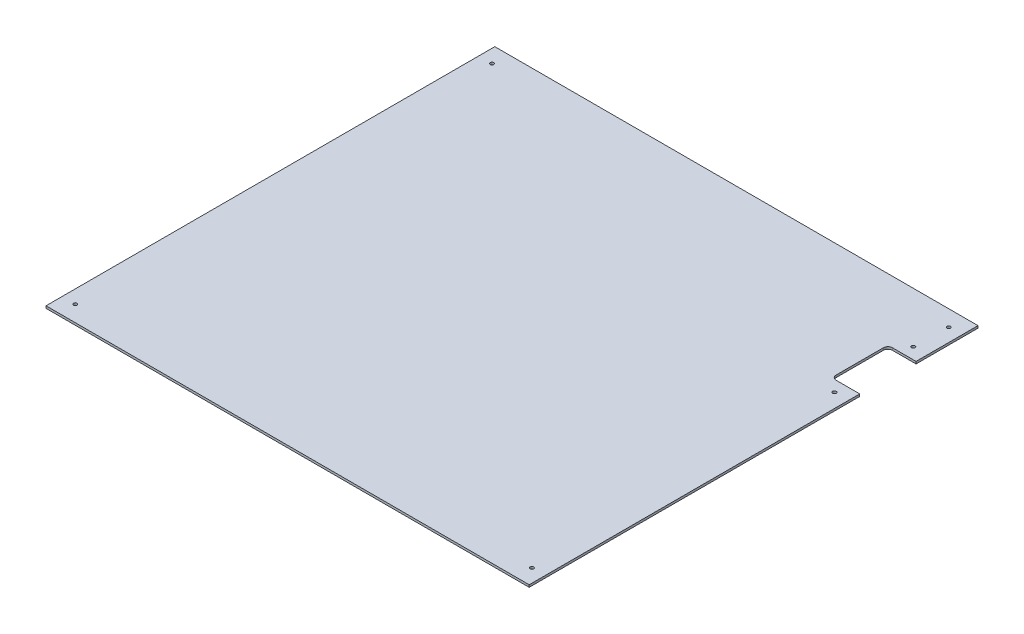
ISO-10303-21;
HEADER;
FILE_DESCRIPTION(('STEP AP214'),'2;1');
FILE_NAME('part.step','',(''),(''),'','','');
FILE_SCHEMA(('AUTOMOTIVE_DESIGN { 1 0 10303 214 1 1 1 1 }'));
ENDSEC;
DATA;
#1=APPLICATION_CONTEXT('core data for automotive mechanical design processes');
#2=APPLICATION_PROTOCOL_DEFINITION('international standard','automotive_design',2000,#1);
#3=PRODUCT_CONTEXT('',#1,'mechanical');
#4=PRODUCT('Part','Part','',(#3));
#5=PRODUCT_RELATED_PRODUCT_CATEGORY('part','',(#4));
#6=PRODUCT_DEFINITION_FORMATION('','',#4);
#7=PRODUCT_DEFINITION_CONTEXT('part definition',#1,'design');
#8=PRODUCT_DEFINITION('design','',#6,#7);
#9=PRODUCT_DEFINITION_SHAPE('','',#8);
#10=(LENGTH_UNIT() NAMED_UNIT(*) SI_UNIT(.MILLI.,.METRE.));
#11=(NAMED_UNIT(*) PLANE_ANGLE_UNIT() SI_UNIT($,.RADIAN.));
#12=(NAMED_UNIT(*) SI_UNIT($,.STERADIAN.) SOLID_ANGLE_UNIT());
#13=UNCERTAINTY_MEASURE_WITH_UNIT(LENGTH_MEASURE(1.E-05),#10,'distance_accuracy_value','');
#14=(GEOMETRIC_REPRESENTATION_CONTEXT(3) GLOBAL_UNCERTAINTY_ASSIGNED_CONTEXT((#13)) GLOBAL_UNIT_ASSIGNED_CONTEXT((#10,
#11,#12)) REPRESENTATION_CONTEXT('',''));
#15=CARTESIAN_POINT('',(0.,0.,0.));
#16=DIRECTION('',(0.,0.,1.));
#17=DIRECTION('',(1.,0.,0.));
#18=AXIS2_PLACEMENT_3D('',#15,#16,#17);
#19=CARTESIAN_POINT('',(429.75,-587.648066447938,-0.750000000000026));
#20=DIRECTION('',(1.,0.,0.));
#21=DIRECTION('',(0.,0.,-1.));
#22=AXIS2_PLACEMENT_3D('',#19,#20,#21);
#23=PLANE('',#22);
#24=DIRECTION('',(0.,1.,0.));
#25=VECTOR('',#24,1.);
#26=CARTESIAN_POINT('',(429.75,-55.9016994374948,-344.25));
#27=LINE('',#26,#25);
#28=CARTESIAN_POINT('',(429.75,0.,-344.25));
#29=VERTEX_POINT('',#28);
#30=CARTESIAN_POINT('',(429.75,2.,-344.25));
#31=VERTEX_POINT('',#30);
#32=EDGE_CURVE('E111',#29,#31,#27,.T.);
#33=ORIENTED_EDGE('',*,*,#32,.F.);
#34=DIRECTION('',(0.,0.,-1.));
#35=VECTOR('',#34,1.);
#36=CARTESIAN_POINT('',(429.75,0.,-0.750000000000026));
#37=LINE('',#36,#35);
#38=CARTESIAN_POINT('',(429.75,0.,-399.25));
#39=VERTEX_POINT('',#38);
#40=EDGE_CURVE('E146',#29,#39,#37,.T.);
#41=ORIENTED_EDGE('',*,*,#40,.T.);
#42=DIRECTION('',(0.,1.,0.));
#43=VECTOR('',#42,1.);
#44=CARTESIAN_POINT('',(429.75,-587.648066447938,-399.25));
#45=LINE('',#44,#43);
#46=CARTESIAN_POINT('',(429.75,2.,-399.25));
#47=VERTEX_POINT('',#46);
#48=EDGE_CURVE('E129',#39,#47,#45,.T.);
#49=ORIENTED_EDGE('',*,*,#48,.T.);
#50=DIRECTION('',(0.,0.,-1.));
#51=VECTOR('',#50,1.);
#52=CARTESIAN_POINT('',(429.75,2.,-0.750000000000026));
#53=LINE('',#52,#51);
#54=EDGE_CURVE('E123',#31,#47,#53,.T.);
#55=ORIENTED_EDGE('',*,*,#54,.F.);
#56=EDGE_LOOP('',(#33,#41,#49,#55));
#57=FACE_BOUND('',#56,.T.);
#58=ADVANCED_FACE('F37',(#57),#23,.T.);
#59=CARTESIAN_POINT('',(0.,2.,0.));
#60=DIRECTION('',(0.,-1.,0.));
#61=DIRECTION('',(0.,0.,-1.));
#62=AXIS2_PLACEMENT_3D('',#59,#60,#61);
#63=PLANE('',#62);
#64=CARTESIAN_POINT('',(417.25,2.,-354.25));
#65=DIRECTION('',(0.,1.,0.));
#66=DIRECTION('',(0.,0.,1.));
#67=AXIS2_PLACEMENT_3D('',#64,#65,#66);
#68=CIRCLE('',#67,1.59999999999996);
#69=CARTESIAN_POINT('',(417.25,2.,-352.65));
#70=VERTEX_POINT('',#69);
#71=EDGE_CURVE('E360',#70,#70,#68,.T.);
#72=ORIENTED_EDGE('',*,*,#71,.F.);
#73=EDGE_LOOP('',(#72));
#74=FACE_BOUND('',#73,.T.);
#75=CARTESIAN_POINT('',(417.25,2.,-284.25));
#76=DIRECTION('',(0.,1.,0.));
#77=DIRECTION('',(0.,0.,1.));
#78=AXIS2_PLACEMENT_3D('',#75,#76,#77);
#79=CIRCLE('',#78,1.59999999999996);
#80=CARTESIAN_POINT('',(417.25,2.,-282.65));
#81=VERTEX_POINT('',#80);
#82=EDGE_CURVE('E367',#81,#81,#79,.T.);
#83=ORIENTED_EDGE('',*,*,#82,.F.);
#84=EDGE_LOOP('',(#83));
#85=FACE_BOUND('',#84,.T.);
#86=CARTESIAN_POINT('',(12.5,2.,-385.));
#87=DIRECTION('',(0.,1.,0.));
#88=DIRECTION('',(0.,0.,1.));
#89=AXIS2_PLACEMENT_3D('',#86,#87,#88);
#90=CIRCLE('',#89,1.55000000000003);
#91=CARTESIAN_POINT('',(12.5,2.,-383.45));
#92=VERTEX_POINT('',#91);
#93=EDGE_CURVE('E172',#92,#92,#90,.T.);
#94=ORIENTED_EDGE('',*,*,#93,.F.);
#95=EDGE_LOOP('',(#94));
#96=FACE_BOUND('',#95,.T.);
#97=CARTESIAN_POINT('',(418.,2.,-385.));
#98=DIRECTION('',(0.,1.,0.));
#99=DIRECTION('',(0.,0.,-1.));
#100=AXIS2_PLACEMENT_3D('',#97,#98,#99);
#101=CIRCLE('',#100,1.55);
#102=CARTESIAN_POINT('',(418.,2.,-386.55));
#103=VERTEX_POINT('',#102);
#104=EDGE_CURVE('E165',#103,#103,#101,.T.);
#105=ORIENTED_EDGE('',*,*,#104,.F.);
#106=EDGE_LOOP('',(#105));
#107=FACE_BOUND('',#106,.T.);
#108=CARTESIAN_POINT('',(418.,2.,-15.));
#109=DIRECTION('',(0.,1.,0.));
#110=DIRECTION('',(0.,0.,1.));
#111=AXIS2_PLACEMENT_3D('',#108,#109,#110);
#112=CIRCLE('',#111,1.54999999999999);
#113=CARTESIAN_POINT('',(418.,2.,-13.45));
#114=VERTEX_POINT('',#113);
#115=EDGE_CURVE('E173',#114,#114,#112,.T.);
#116=ORIENTED_EDGE('',*,*,#115,.F.);
#117=EDGE_LOOP('',(#116));
#118=FACE_BOUND('',#117,.T.);
#119=CARTESIAN_POINT('',(12.5,2.,-15.));
#120=DIRECTION('',(0.,1.,0.));
#121=DIRECTION('',(0.,0.,-1.));
#122=AXIS2_PLACEMENT_3D('',#119,#120,#121);
#123=CIRCLE('',#122,1.55000000000002);
#124=CARTESIAN_POINT('',(12.5,2.,-16.55));
#125=VERTEX_POINT('',#124);
#126=EDGE_CURVE('E154',#125,#125,#123,.T.);
#127=ORIENTED_EDGE('',*,*,#126,.F.);
#128=EDGE_LOOP('',(#127));
#129=FACE_BOUND('',#128,.T.);
#130=DIRECTION('',(0.,0.,1.));
#131=VECTOR('',#130,1.);
#132=CARTESIAN_POINT('',(404.75,2.,-344.25));
#133=LINE('',#132,#131);
#134=CARTESIAN_POINT('',(404.75,2.,-340.25));
#135=VERTEX_POINT('',#134);
#136=CARTESIAN_POINT('',(404.75,2.,-298.25));
#137=VERTEX_POINT('',#136);
#138=EDGE_CURVE('E125',#135,#137,#133,.T.);
#139=ORIENTED_EDGE('',*,*,#138,.F.);
#140=CARTESIAN_POINT('',(408.75,2.,-340.25));
#141=DIRECTION('',(0.,-1.,0.));
#142=DIRECTION('',(0.,0.,-1.));
#143=AXIS2_PLACEMENT_3D('',#140,#141,#142);
#144=CIRCLE('',#143,4.);
#145=CARTESIAN_POINT('',(408.75,2.,-344.25));
#146=VERTEX_POINT('',#145);
#147=EDGE_CURVE('E45',#135,#146,#144,.T.);
#148=ORIENTED_EDGE('',*,*,#147,.T.);
#149=DIRECTION('',(-1.,0.,0.));
#150=VECTOR('',#149,1.);
#151=CARTESIAN_POINT('',(429.75,2.,-344.25));
#152=LINE('',#151,#150);
#153=EDGE_CURVE('E113',#31,#146,#152,.T.);
#154=ORIENTED_EDGE('',*,*,#153,.F.);
#155=ORIENTED_EDGE('',*,*,#54,.T.);
#156=DIRECTION('',(-1.,0.,0.));
#157=VECTOR('',#156,1.);
#158=CARTESIAN_POINT('',(429.75,2.,-399.25));
#159=LINE('',#158,#157);
#160=CARTESIAN_POINT('',(0.75,2.,-399.25));
#161=VERTEX_POINT('',#160);
#162=EDGE_CURVE('E139',#47,#161,#159,.T.);
#163=ORIENTED_EDGE('',*,*,#162,.T.);
#164=DIRECTION('',(0.,0.,1.));
#165=VECTOR('',#164,1.);
#166=CARTESIAN_POINT('',(0.75,2.,-399.25));
#167=LINE('',#166,#165);
#168=CARTESIAN_POINT('',(0.750000000000049,2.,-0.75));
#169=VERTEX_POINT('',#168);
#170=EDGE_CURVE('E163',#161,#169,#167,.T.);
#171=ORIENTED_EDGE('',*,*,#170,.T.);
#172=DIRECTION('',(1.,0.,0.));
#173=VECTOR('',#172,1.);
#174=CARTESIAN_POINT('',(0.750000000000049,2.,-0.75));
#175=LINE('',#174,#173);
#176=CARTESIAN_POINT('',(429.75,2.,-0.750000000000026));
#177=VERTEX_POINT('',#176);
#178=EDGE_CURVE('E159',#169,#177,#175,.T.);
#179=ORIENTED_EDGE('',*,*,#178,.T.);
#180=CARTESIAN_POINT('',(429.75,2.,-294.25));
#181=VERTEX_POINT('',#180);
#182=EDGE_CURVE('E131',#177,#181,#53,.T.);
#183=ORIENTED_EDGE('',*,*,#182,.T.);
#184=DIRECTION('',(1.,0.,0.));
#185=VECTOR('',#184,1.);
#186=CARTESIAN_POINT('',(429.75,2.,-294.25));
#187=LINE('',#186,#185);
#188=CARTESIAN_POINT('',(408.75,2.,-294.25));
#189=VERTEX_POINT('',#188);
#190=EDGE_CURVE('E221',#189,#181,#187,.T.);
#191=ORIENTED_EDGE('',*,*,#190,.F.);
#192=CARTESIAN_POINT('',(408.75,2.,-298.25));
#193=DIRECTION('',(0.,-1.,0.));
#194=DIRECTION('',(0.,0.,-1.));
#195=AXIS2_PLACEMENT_3D('',#192,#193,#194);
#196=CIRCLE('',#195,4.);
#197=EDGE_CURVE('E197',#189,#137,#196,.T.);
#198=ORIENTED_EDGE('',*,*,#197,.T.);
#199=EDGE_LOOP('',(#139,#148,#154,#155,#163,#171,#179,#183,#191,#198));
#200=FACE_BOUND('',#199,.T.);
#201=ADVANCED_FACE('F121',(#74,#85,#96,#107,#118,#129,#200),#63,.F.);
#202=CARTESIAN_POINT('',(0.,0.,0.));
#203=DIRECTION('',(0.,-1.,0.));
#204=DIRECTION('',(0.,0.,-1.));
#205=AXIS2_PLACEMENT_3D('',#202,#203,#204);
#206=PLANE('',#205);
#207=CARTESIAN_POINT('',(417.25,0.,-354.25));
#208=DIRECTION('',(0.,-1.,0.));
#209=DIRECTION('',(0.,0.,-1.));
#210=AXIS2_PLACEMENT_3D('',#207,#208,#209);
#211=CIRCLE('',#210,1.59999999999996);
#212=CARTESIAN_POINT('',(417.25,0.,-352.65));
#213=VERTEX_POINT('',#212);
#214=EDGE_CURVE('E126',#213,#213,#211,.F.);
#215=ORIENTED_EDGE('',*,*,#214,.T.);
#216=EDGE_LOOP('',(#215));
#217=FACE_BOUND('',#216,.T.);
#218=CARTESIAN_POINT('',(417.25,0.,-284.25));
#219=DIRECTION('',(0.,-1.,0.));
#220=DIRECTION('',(0.,0.,-1.));
#221=AXIS2_PLACEMENT_3D('',#218,#219,#220);
#222=CIRCLE('',#221,1.59999999999996);
#223=CARTESIAN_POINT('',(417.25,0.,-282.65));
#224=VERTEX_POINT('',#223);
#225=EDGE_CURVE('E364',#224,#224,#222,.F.);
#226=ORIENTED_EDGE('',*,*,#225,.T.);
#227=EDGE_LOOP('',(#226));
#228=FACE_BOUND('',#227,.T.);
#229=DIRECTION('',(-1.,0.,0.));
#230=VECTOR('',#229,1.);
#231=CARTESIAN_POINT('',(429.75,0.,-344.25));
#232=LINE('',#231,#230);
#233=CARTESIAN_POINT('',(408.75,0.,-344.25));
#234=VERTEX_POINT('',#233);
#235=EDGE_CURVE('E114',#29,#234,#232,.T.);
#236=ORIENTED_EDGE('',*,*,#235,.T.);
#237=CARTESIAN_POINT('',(408.75,0.,-340.25));
#238=DIRECTION('',(0.,-1.,0.));
#239=DIRECTION('',(0.,0.,-1.));
#240=AXIS2_PLACEMENT_3D('',#237,#238,#239);
#241=CIRCLE('',#240,4.);
#242=CARTESIAN_POINT('',(404.75,0.,-340.25));
#243=VERTEX_POINT('',#242);
#244=EDGE_CURVE('E11',#234,#243,#241,.F.);
#245=ORIENTED_EDGE('',*,*,#244,.T.);
#246=DIRECTION('',(0.,0.,1.));
#247=VECTOR('',#246,1.);
#248=CARTESIAN_POINT('',(404.75,0.,-344.25));
#249=LINE('',#248,#247);
#250=CARTESIAN_POINT('',(404.75,0.,-298.25));
#251=VERTEX_POINT('',#250);
#252=EDGE_CURVE('E210',#243,#251,#249,.T.);
#253=ORIENTED_EDGE('',*,*,#252,.T.);
#254=CARTESIAN_POINT('',(408.75,0.,-298.25));
#255=DIRECTION('',(0.,-1.,0.));
#256=DIRECTION('',(0.,0.,-1.));
#257=AXIS2_PLACEMENT_3D('',#254,#255,#256);
#258=CIRCLE('',#257,4.);
#259=CARTESIAN_POINT('',(408.75,0.,-294.25));
#260=VERTEX_POINT('',#259);
#261=EDGE_CURVE('E199',#251,#260,#258,.F.);
#262=ORIENTED_EDGE('',*,*,#261,.T.);
#263=DIRECTION('',(1.,0.,0.));
#264=VECTOR('',#263,1.);
#265=CARTESIAN_POINT('',(429.75,0.,-294.25));
#266=LINE('',#265,#264);
#267=CARTESIAN_POINT('',(429.75,0.,-294.25));
#268=VERTEX_POINT('',#267);
#269=EDGE_CURVE('E207',#260,#268,#266,.T.);
#270=ORIENTED_EDGE('',*,*,#269,.T.);
#271=CARTESIAN_POINT('',(429.75,0.,-0.750000000000026));
#272=VERTEX_POINT('',#271);
#273=EDGE_CURVE('E141',#272,#268,#37,.T.);
#274=ORIENTED_EDGE('',*,*,#273,.F.);
#275=DIRECTION('',(1.,0.,0.));
#276=VECTOR('',#275,1.);
#277=CARTESIAN_POINT('',(0.750000000000049,0.,-0.75));
#278=LINE('',#277,#276);
#279=CARTESIAN_POINT('',(0.750000000000049,0.,-0.75));
#280=VERTEX_POINT('',#279);
#281=EDGE_CURVE('E147',#280,#272,#278,.T.);
#282=ORIENTED_EDGE('',*,*,#281,.F.);
#283=DIRECTION('',(0.,0.,1.));
#284=VECTOR('',#283,1.);
#285=CARTESIAN_POINT('',(0.75,0.,-399.25));
#286=LINE('',#285,#284);
#287=CARTESIAN_POINT('',(0.749999999999973,0.,-399.25));
#288=VERTEX_POINT('',#287);
#289=EDGE_CURVE('E150',#288,#280,#286,.T.);
#290=ORIENTED_EDGE('',*,*,#289,.F.);
#291=DIRECTION('',(-1.,0.,0.));
#292=VECTOR('',#291,1.);
#293=CARTESIAN_POINT('',(429.75,0.,-399.25));
#294=LINE('',#293,#292);
#295=EDGE_CURVE('E145',#39,#288,#294,.T.);
#296=ORIENTED_EDGE('',*,*,#295,.F.);
#297=ORIENTED_EDGE('',*,*,#40,.F.);
#298=EDGE_LOOP('',(#236,#245,#253,#262,#270,#274,#282,#290,#296,#297));
#299=FACE_BOUND('',#298,.T.);
#300=CARTESIAN_POINT('',(12.5,0.,-385.));
#301=DIRECTION('',(0.,-1.,0.));
#302=DIRECTION('',(0.,0.,-1.));
#303=AXIS2_PLACEMENT_3D('',#300,#301,#302);
#304=CIRCLE('',#303,1.55000000000003);
#305=CARTESIAN_POINT('',(12.5,0.,-386.55));
#306=VERTEX_POINT('',#305);
#307=EDGE_CURVE('E185',#306,#306,#304,.F.);
#308=ORIENTED_EDGE('',*,*,#307,.T.);
#309=EDGE_LOOP('',(#308));
#310=FACE_BOUND('',#309,.T.);
#311=CARTESIAN_POINT('',(418.,0.,-385.));
#312=DIRECTION('',(0.,-1.,0.));
#313=DIRECTION('',(0.,0.,-1.));
#314=AXIS2_PLACEMENT_3D('',#311,#312,#313);
#315=CIRCLE('',#314,1.55);
#316=CARTESIAN_POINT('',(418.,0.,-386.55));
#317=VERTEX_POINT('',#316);
#318=EDGE_CURVE('E168',#317,#317,#315,.F.);
#319=ORIENTED_EDGE('',*,*,#318,.T.);
#320=EDGE_LOOP('',(#319));
#321=FACE_BOUND('',#320,.T.);
#322=CARTESIAN_POINT('',(418.,0.,-15.));
#323=DIRECTION('',(0.,-1.,0.));
#324=DIRECTION('',(0.,0.,-1.));
#325=AXIS2_PLACEMENT_3D('',#322,#323,#324);
#326=CIRCLE('',#325,1.54999999999999);
#327=CARTESIAN_POINT('',(418.,0.,-16.55));
#328=VERTEX_POINT('',#327);
#329=EDGE_CURVE('E169',#328,#328,#326,.F.);
#330=ORIENTED_EDGE('',*,*,#329,.T.);
#331=EDGE_LOOP('',(#330));
#332=FACE_BOUND('',#331,.T.);
#333=CARTESIAN_POINT('',(12.5,0.,-15.));
#334=DIRECTION('',(0.,-1.,0.));
#335=DIRECTION('',(0.,0.,-1.));
#336=AXIS2_PLACEMENT_3D('',#333,#334,#335);
#337=CIRCLE('',#336,1.55000000000002);
#338=CARTESIAN_POINT('',(12.5,0.,-16.55));
#339=VERTEX_POINT('',#338);
#340=EDGE_CURVE('E176',#339,#339,#337,.F.);
#341=ORIENTED_EDGE('',*,*,#340,.T.);
#342=EDGE_LOOP('',(#341));
#343=FACE_BOUND('',#342,.T.);
#344=ADVANCED_FACE('F204',(#217,#228,#299,#310,#321,#332,#343),#206,.T.);
#345=CARTESIAN_POINT('',(12.5,-4.38406204335671,-385.));
#346=DIRECTION('',(0.,1.,0.));
#347=DIRECTION('',(0.,0.,1.));
#348=AXIS2_PLACEMENT_3D('',#345,#346,#347);
#349=CYLINDRICAL_SURFACE('',#348,1.55000000000003);
#350=ORIENTED_EDGE('',*,*,#93,.T.);
#351=EDGE_LOOP('',(#350));
#352=FACE_BOUND('',#351,.T.);
#353=ORIENTED_EDGE('',*,*,#307,.F.);
#354=EDGE_LOOP('',(#353));
#355=FACE_BOUND('',#354,.T.);
#356=ADVANCED_FACE('F269',(#352,#355),#349,.F.);
#357=CARTESIAN_POINT('',(418.,-4.38406204335671,-385.));
#358=DIRECTION('',(0.,1.,0.));
#359=DIRECTION('',(0.,0.,1.));
#360=AXIS2_PLACEMENT_3D('',#357,#358,#359);
#361=CYLINDRICAL_SURFACE('',#360,1.55);
#362=ORIENTED_EDGE('',*,*,#104,.T.);
#363=EDGE_LOOP('',(#362));
#364=FACE_BOUND('',#363,.T.);
#365=ORIENTED_EDGE('',*,*,#318,.F.);
#366=EDGE_LOOP('',(#365));
#367=FACE_BOUND('',#366,.T.);
#368=ADVANCED_FACE('F388',(#364,#367),#361,.F.);
#369=CARTESIAN_POINT('',(418.,-4.38406204335671,-15.));
#370=DIRECTION('',(0.,1.,0.));
#371=DIRECTION('',(0.,0.,1.));
#372=AXIS2_PLACEMENT_3D('',#369,#370,#371);
#373=CYLINDRICAL_SURFACE('',#372,1.54999999999999);
#374=ORIENTED_EDGE('',*,*,#115,.T.);
#375=EDGE_LOOP('',(#374));
#376=FACE_BOUND('',#375,.T.);
#377=ORIENTED_EDGE('',*,*,#329,.F.);
#378=EDGE_LOOP('',(#377));
#379=FACE_BOUND('',#378,.T.);
#380=ADVANCED_FACE('F256',(#376,#379),#373,.F.);
#381=CARTESIAN_POINT('',(12.5,-4.38406204335671,-15.));
#382=DIRECTION('',(0.,1.,0.));
#383=DIRECTION('',(0.,0.,1.));
#384=AXIS2_PLACEMENT_3D('',#381,#382,#383);
#385=CYLINDRICAL_SURFACE('',#384,1.55000000000002);
#386=ORIENTED_EDGE('',*,*,#126,.T.);
#387=EDGE_LOOP('',(#386));
#388=FACE_BOUND('',#387,.T.);
#389=ORIENTED_EDGE('',*,*,#340,.F.);
#390=EDGE_LOOP('',(#389));
#391=FACE_BOUND('',#390,.T.);
#392=ADVANCED_FACE('F249',(#388,#391),#385,.F.);
#393=DIRECTION('',(0.,1.,0.));
#394=VECTOR('',#393,1.);
#395=CARTESIAN_POINT('',(429.75,-55.9016994374948,-294.25));
#396=LINE('',#395,#394);
#397=EDGE_CURVE('E119',#268,#181,#396,.T.);
#398=ORIENTED_EDGE('',*,*,#397,.T.);
#399=ORIENTED_EDGE('',*,*,#182,.F.);
#400=DIRECTION('',(0.,1.,0.));
#401=VECTOR('',#400,1.);
#402=CARTESIAN_POINT('',(429.75,-587.648066447938,-0.750000000000026));
#403=LINE('',#402,#401);
#404=EDGE_CURVE('E118',#272,#177,#403,.T.);
#405=ORIENTED_EDGE('',*,*,#404,.F.);
#406=ORIENTED_EDGE('',*,*,#273,.T.);
#407=EDGE_LOOP('',(#398,#399,#405,#406));
#408=FACE_BOUND('',#407,.T.);
#409=ADVANCED_FACE('F247',(#408),#23,.T.);
#410=CARTESIAN_POINT('',(0.750000000000049,-587.648066447938,-0.75));
#411=DIRECTION('',(0.,0.,1.));
#412=DIRECTION('',(1.,0.,0.));
#413=AXIS2_PLACEMENT_3D('',#410,#411,#412);
#414=PLANE('',#413);
#415=ORIENTED_EDGE('',*,*,#281,.T.);
#416=ORIENTED_EDGE('',*,*,#404,.T.);
#417=ORIENTED_EDGE('',*,*,#178,.F.);
#418=DIRECTION('',(0.,1.,0.));
#419=VECTOR('',#418,1.);
#420=CARTESIAN_POINT('',(0.750000000000049,-587.648066447938,-0.75));
#421=LINE('',#420,#419);
#422=EDGE_CURVE('E135',#280,#169,#421,.T.);
#423=ORIENTED_EDGE('',*,*,#422,.F.);
#424=EDGE_LOOP('',(#415,#416,#417,#423));
#425=FACE_BOUND('',#424,.T.);
#426=ADVANCED_FACE('F244',(#425),#414,.T.);
#427=CARTESIAN_POINT('',(0.75,-587.648066447938,-399.25));
#428=DIRECTION('',(-1.,0.,0.));
#429=DIRECTION('',(0.,0.,1.));
#430=AXIS2_PLACEMENT_3D('',#427,#428,#429);
#431=PLANE('',#430);
#432=ORIENTED_EDGE('',*,*,#289,.T.);
#433=ORIENTED_EDGE('',*,*,#422,.T.);
#434=ORIENTED_EDGE('',*,*,#170,.F.);
#435=DIRECTION('',(0.,1.,0.));
#436=VECTOR('',#435,1.);
#437=CARTESIAN_POINT('',(0.75,-587.648066447938,-399.25));
#438=LINE('',#437,#436);
#439=EDGE_CURVE('E160',#288,#161,#438,.T.);
#440=ORIENTED_EDGE('',*,*,#439,.F.);
#441=EDGE_LOOP('',(#432,#433,#434,#440));
#442=FACE_BOUND('',#441,.T.);
#443=ADVANCED_FACE('F237',(#442),#431,.T.);
#444=CARTESIAN_POINT('',(429.75,-587.648066447938,-399.25));
#445=DIRECTION('',(0.,0.,-1.));
#446=DIRECTION('',(-1.,0.,0.));
#447=AXIS2_PLACEMENT_3D('',#444,#445,#446);
#448=PLANE('',#447);
#449=ORIENTED_EDGE('',*,*,#295,.T.);
#450=ORIENTED_EDGE('',*,*,#439,.T.);
#451=ORIENTED_EDGE('',*,*,#162,.F.);
#452=ORIENTED_EDGE('',*,*,#48,.F.);
#453=EDGE_LOOP('',(#449,#450,#451,#452));
#454=FACE_BOUND('',#453,.T.);
#455=ADVANCED_FACE('F239',(#454),#448,.T.);
#456=CARTESIAN_POINT('',(429.75,-55.9016994374948,-344.25));
#457=DIRECTION('',(0.,0.,-1.));
#458=DIRECTION('',(-1.,0.,0.));
#459=AXIS2_PLACEMENT_3D('',#456,#457,#458);
#460=PLANE('',#459);
#461=ORIENTED_EDGE('',*,*,#153,.T.);
#462=DIRECTION('',(0.,1.,0.));
#463=VECTOR('',#462,1.);
#464=CARTESIAN_POINT('',(408.75,0.,-344.25));
#465=LINE('',#464,#463);
#466=EDGE_CURVE('E52',#146,#234,#465,.F.);
#467=ORIENTED_EDGE('',*,*,#466,.T.);
#468=ORIENTED_EDGE('',*,*,#235,.F.);
#469=ORIENTED_EDGE('',*,*,#32,.T.);
#470=EDGE_LOOP('',(#461,#467,#468,#469));
#471=FACE_BOUND('',#470,.T.);
#472=ADVANCED_FACE('F112',(#471),#460,.F.);
#473=CARTESIAN_POINT('',(404.75,-55.9016994374948,-344.25));
#474=DIRECTION('',(-1.,0.,0.));
#475=DIRECTION('',(0.,0.,1.));
#476=AXIS2_PLACEMENT_3D('',#473,#474,#475);
#477=PLANE('',#476);
#478=ORIENTED_EDGE('',*,*,#138,.T.);
#479=DIRECTION('',(0.,1.,0.));
#480=VECTOR('',#479,1.);
#481=CARTESIAN_POINT('',(404.75,0.,-298.25));
#482=LINE('',#481,#480);
#483=EDGE_CURVE('E194',#137,#251,#482,.F.);
#484=ORIENTED_EDGE('',*,*,#483,.T.);
#485=ORIENTED_EDGE('',*,*,#252,.F.);
#486=DIRECTION('',(0.,1.,0.));
#487=VECTOR('',#486,1.);
#488=CARTESIAN_POINT('',(404.75,2.,-340.25));
#489=LINE('',#488,#487);
#490=EDGE_CURVE('E191',#243,#135,#489,.T.);
#491=ORIENTED_EDGE('',*,*,#490,.T.);
#492=EDGE_LOOP('',(#478,#484,#485,#491));
#493=FACE_BOUND('',#492,.T.);
#494=ADVANCED_FACE('F223',(#493),#477,.F.);
#495=CARTESIAN_POINT('',(429.75,-55.9016994374948,-294.25));
#496=DIRECTION('',(0.,0.,1.));
#497=DIRECTION('',(1.,0.,0.));
#498=AXIS2_PLACEMENT_3D('',#495,#496,#497);
#499=PLANE('',#498);
#500=ORIENTED_EDGE('',*,*,#269,.F.);
#501=DIRECTION('',(0.,1.,0.));
#502=VECTOR('',#501,1.);
#503=CARTESIAN_POINT('',(408.75,2.,-294.25));
#504=LINE('',#503,#502);
#505=EDGE_CURVE('E188',#260,#189,#504,.T.);
#506=ORIENTED_EDGE('',*,*,#505,.T.);
#507=ORIENTED_EDGE('',*,*,#190,.T.);
#508=ORIENTED_EDGE('',*,*,#397,.F.);
#509=EDGE_LOOP('',(#500,#506,#507,#508));
#510=FACE_BOUND('',#509,.T.);
#511=ADVANCED_FACE('F215',(#510),#499,.F.);
#512=CARTESIAN_POINT('',(408.75,-55.9016994374948,-298.25));
#513=DIRECTION('',(0.,-1.,0.));
#514=DIRECTION('',(0.,0.,-1.));
#515=AXIS2_PLACEMENT_3D('',#512,#513,#514);
#516=CYLINDRICAL_SURFACE('',#515,4.);
#517=ORIENTED_EDGE('',*,*,#261,.F.);
#518=ORIENTED_EDGE('',*,*,#483,.F.);
#519=ORIENTED_EDGE('',*,*,#197,.F.);
#520=ORIENTED_EDGE('',*,*,#505,.F.);
#521=EDGE_LOOP('',(#517,#518,#519,#520));
#522=FACE_BOUND('',#521,.T.);
#523=ADVANCED_FACE('F219',(#522),#516,.F.);
#524=CARTESIAN_POINT('',(408.75,-55.9016994374948,-340.25));
#525=DIRECTION('',(0.,-1.,0.));
#526=DIRECTION('',(0.,0.,-1.));
#527=AXIS2_PLACEMENT_3D('',#524,#525,#526);
#528=CYLINDRICAL_SURFACE('',#527,4.);
#529=ORIENTED_EDGE('',*,*,#244,.F.);
#530=ORIENTED_EDGE('',*,*,#466,.F.);
#531=ORIENTED_EDGE('',*,*,#147,.F.);
#532=ORIENTED_EDGE('',*,*,#490,.F.);
#533=EDGE_LOOP('',(#529,#530,#531,#532));
#534=FACE_BOUND('',#533,.T.);
#535=ADVANCED_FACE('F39',(#534),#528,.F.);
#536=CARTESIAN_POINT('',(417.25,-4.52548339959372,-284.25));
#537=DIRECTION('',(0.,1.,0.));
#538=DIRECTION('',(0.,0.,1.));
#539=AXIS2_PLACEMENT_3D('',#536,#537,#538);
#540=CYLINDRICAL_SURFACE('',#539,1.59999999999996);
#541=CARTESIAN_POINT('',(417.25,2.,-282.65));
#542=CARTESIAN_POINT('',(417.25,1.97916666666667,-282.65));
#543=CARTESIAN_POINT('',(417.25,1.95833333333333,-282.65));
#544=CARTESIAN_POINT('',(417.25,1.91666666666667,-282.65));
#545=CARTESIAN_POINT('',(417.25,1.89583333333333,-282.65));
#546=CARTESIAN_POINT('',(417.25,1.85416666666667,-282.65));
#547=CARTESIAN_POINT('',(417.25,1.83333333333333,-282.65));
#548=CARTESIAN_POINT('',(417.25,1.79166666666667,-282.65));
#549=CARTESIAN_POINT('',(417.25,1.77083333333333,-282.65));
#550=CARTESIAN_POINT('',(417.25,1.72916666666667,-282.65));
#551=CARTESIAN_POINT('',(417.25,1.70833333333333,-282.65));
#552=CARTESIAN_POINT('',(417.25,1.66666666666667,-282.65));
#553=CARTESIAN_POINT('',(417.25,1.64583333333333,-282.65));
#554=CARTESIAN_POINT('',(417.25,1.60416666666667,-282.65));
#555=CARTESIAN_POINT('',(417.25,1.58333333333333,-282.65));
#556=CARTESIAN_POINT('',(417.25,1.54166666666667,-282.65));
#557=CARTESIAN_POINT('',(417.25,1.52083333333333,-282.65));
#558=CARTESIAN_POINT('',(417.25,1.47916666666667,-282.65));
#559=CARTESIAN_POINT('',(417.25,1.45833333333333,-282.65));
#560=CARTESIAN_POINT('',(417.25,1.41666666666667,-282.65));
#561=CARTESIAN_POINT('',(417.25,1.39583333333333,-282.65));
#562=CARTESIAN_POINT('',(417.25,1.35416666666667,-282.65));
#563=CARTESIAN_POINT('',(417.25,1.33333333333333,-282.65));
#564=CARTESIAN_POINT('',(417.25,1.29166666666667,-282.65));
#565=CARTESIAN_POINT('',(417.25,1.27083333333333,-282.65));
#566=CARTESIAN_POINT('',(417.25,1.22916666666667,-282.65));
#567=CARTESIAN_POINT('',(417.25,1.20833333333333,-282.65));
#568=CARTESIAN_POINT('',(417.25,1.16666666666667,-282.65));
#569=CARTESIAN_POINT('',(417.25,1.14583333333333,-282.65));
#570=CARTESIAN_POINT('',(417.25,1.10416666666667,-282.65));
#571=CARTESIAN_POINT('',(417.25,1.08333333333333,-282.65));
#572=CARTESIAN_POINT('',(417.25,1.04166666666667,-282.65));
#573=CARTESIAN_POINT('',(417.25,1.02083333333333,-282.65));
#574=CARTESIAN_POINT('',(417.25,0.979166666666667,-282.65));
#575=CARTESIAN_POINT('',(417.25,0.958333333333333,-282.65));
#576=CARTESIAN_POINT('',(417.25,0.916666666666667,-282.65));
#577=CARTESIAN_POINT('',(417.25,0.895833333333333,-282.65));
#578=CARTESIAN_POINT('',(417.25,0.854166666666667,-282.65));
#579=CARTESIAN_POINT('',(417.25,0.833333333333333,-282.65));
#580=CARTESIAN_POINT('',(417.25,0.791666666666667,-282.65));
#581=CARTESIAN_POINT('',(417.25,0.770833333333333,-282.65));
#582=CARTESIAN_POINT('',(417.25,0.729166666666667,-282.65));
#583=CARTESIAN_POINT('',(417.25,0.708333333333333,-282.65));
#584=CARTESIAN_POINT('',(417.25,0.666666666666667,-282.65));
#585=CARTESIAN_POINT('',(417.25,0.645833333333334,-282.65));
#586=CARTESIAN_POINT('',(417.25,0.604166666666667,-282.65));
#587=CARTESIAN_POINT('',(417.25,0.583333333333334,-282.65));
#588=CARTESIAN_POINT('',(417.25,0.541666666666667,-282.65));
#589=CARTESIAN_POINT('',(417.25,0.520833333333334,-282.65));
#590=CARTESIAN_POINT('',(417.25,0.479166666666667,-282.65));
#591=CARTESIAN_POINT('',(417.25,0.458333333333334,-282.65));
#592=CARTESIAN_POINT('',(417.25,0.416666666666667,-282.65));
#593=CARTESIAN_POINT('',(417.25,0.395833333333334,-282.65));
#594=CARTESIAN_POINT('',(417.25,0.354166666666667,-282.65));
#595=CARTESIAN_POINT('',(417.25,0.333333333333334,-282.65));
#596=CARTESIAN_POINT('',(417.25,0.291666666666668,-282.65));
#597=CARTESIAN_POINT('',(417.25,0.270833333333334,-282.65));
#598=CARTESIAN_POINT('',(417.25,0.229166666666668,-282.65));
#599=CARTESIAN_POINT('',(417.25,0.208333333333334,-282.65));
#600=CARTESIAN_POINT('',(417.25,0.166666666666668,-282.65));
#601=CARTESIAN_POINT('',(417.25,0.145833333333334,-282.65));
#602=CARTESIAN_POINT('',(417.25,0.104166666666668,-282.65));
#603=CARTESIAN_POINT('',(417.25,0.0833333333333343,-282.65));
#604=CARTESIAN_POINT('',(417.25,0.0416666666666676,-282.65));
#605=CARTESIAN_POINT('',(417.25,0.0208333333333342,-282.65));
#606=CARTESIAN_POINT('',(417.25,0.,-282.65));
#607=B_SPLINE_CURVE_WITH_KNOTS('',3,(#541,#542,#543,#544,#545,#546,#547,#548,#549,#550,#551,
#552,#553,#554,#555,#556,#557,#558,#559,#560,#561,#562,#563,#564,#565,#566,#567,#568,#569,#570,
#571,#572,#573,#574,#575,#576,#577,#578,#579,#580,#581,#582,#583,#584,#585,#586,#587,#588,#589,
#590,#591,#592,#593,#594,#595,#596,#597,#598,#599,#600,#601,#602,#603,#604,#605,#606),
.UNSPECIFIED.,.F.,.F.,(4,2,2,2,2,2,2,2,2,2,2,2,2,2,2,2,2,2,2,2,2,2,2,2,2,2,2,2,2,2,2,2,4),(0.,
0.0625000000000001,0.125,0.1875,0.25,0.312499999999999,0.374999999999999,0.4375,0.5,0.5625,
0.625,0.6875,0.749999999999999,0.812499999999999,0.874999999999999,0.937499999999999,
0.999999999999999,1.0625,1.125,1.1875,1.25,1.3125,1.375,1.4375,1.5,1.5625,1.625,1.6875,1.75,
1.8125,1.875,1.9375,2.),.UNSPECIFIED.);
#608=EDGE_CURVE('BSEAM280',#81,#224,#607,.T.);
#609=ORIENTED_EDGE('',*,*,#82,.T.);
#610=ORIENTED_EDGE('',*,*,#225,.F.);
#611=ORIENTED_EDGE('',*,*,#608,.T.);
#612=ORIENTED_EDGE('',*,*,#608,.F.);
#613=EDGE_LOOP('',(#609,#611,#610,#612));
#614=FACE_BOUND('',#613,.T.);
#615=ADVANCED_FACE('F280',(#614),#540,.F.);
#616=CARTESIAN_POINT('',(417.25,-4.52548339959372,-354.25));
#617=DIRECTION('',(0.,1.,0.));
#618=DIRECTION('',(0.,0.,1.));
#619=AXIS2_PLACEMENT_3D('',#616,#617,#618);
#620=CYLINDRICAL_SURFACE('',#619,1.59999999999996);
#621=CARTESIAN_POINT('',(417.25,2.,-352.65));
#622=CARTESIAN_POINT('',(417.25,1.97916666666667,-352.65));
#623=CARTESIAN_POINT('',(417.25,1.95833333333333,-352.65));
#624=CARTESIAN_POINT('',(417.25,1.91666666666667,-352.65));
#625=CARTESIAN_POINT('',(417.25,1.89583333333333,-352.65));
#626=CARTESIAN_POINT('',(417.25,1.85416666666667,-352.65));
#627=CARTESIAN_POINT('',(417.25,1.83333333333333,-352.65));
#628=CARTESIAN_POINT('',(417.25,1.79166666666667,-352.65));
#629=CARTESIAN_POINT('',(417.25,1.77083333333333,-352.65));
#630=CARTESIAN_POINT('',(417.25,1.72916666666667,-352.65));
#631=CARTESIAN_POINT('',(417.25,1.70833333333333,-352.65));
#632=CARTESIAN_POINT('',(417.25,1.66666666666667,-352.65));
#633=CARTESIAN_POINT('',(417.25,1.64583333333333,-352.65));
#634=CARTESIAN_POINT('',(417.25,1.60416666666667,-352.65));
#635=CARTESIAN_POINT('',(417.25,1.58333333333333,-352.65));
#636=CARTESIAN_POINT('',(417.25,1.54166666666667,-352.65));
#637=CARTESIAN_POINT('',(417.25,1.52083333333333,-352.65));
#638=CARTESIAN_POINT('',(417.25,1.47916666666667,-352.65));
#639=CARTESIAN_POINT('',(417.25,1.45833333333333,-352.65));
#640=CARTESIAN_POINT('',(417.25,1.41666666666667,-352.65));
#641=CARTESIAN_POINT('',(417.25,1.39583333333333,-352.65));
#642=CARTESIAN_POINT('',(417.25,1.35416666666667,-352.65));
#643=CARTESIAN_POINT('',(417.25,1.33333333333333,-352.65));
#644=CARTESIAN_POINT('',(417.25,1.29166666666667,-352.65));
#645=CARTESIAN_POINT('',(417.25,1.27083333333333,-352.65));
#646=CARTESIAN_POINT('',(417.25,1.22916666666667,-352.65));
#647=CARTESIAN_POINT('',(417.25,1.20833333333333,-352.65));
#648=CARTESIAN_POINT('',(417.25,1.16666666666667,-352.65));
#649=CARTESIAN_POINT('',(417.25,1.14583333333333,-352.65));
#650=CARTESIAN_POINT('',(417.25,1.10416666666667,-352.65));
#651=CARTESIAN_POINT('',(417.25,1.08333333333333,-352.65));
#652=CARTESIAN_POINT('',(417.25,1.04166666666667,-352.65));
#653=CARTESIAN_POINT('',(417.25,1.02083333333333,-352.65));
#654=CARTESIAN_POINT('',(417.25,0.979166666666667,-352.65));
#655=CARTESIAN_POINT('',(417.25,0.958333333333333,-352.65));
#656=CARTESIAN_POINT('',(417.25,0.916666666666667,-352.65));
#657=CARTESIAN_POINT('',(417.25,0.895833333333333,-352.65));
#658=CARTESIAN_POINT('',(417.25,0.854166666666667,-352.65));
#659=CARTESIAN_POINT('',(417.25,0.833333333333333,-352.65));
#660=CARTESIAN_POINT('',(417.25,0.791666666666667,-352.65));
#661=CARTESIAN_POINT('',(417.25,0.770833333333333,-352.65));
#662=CARTESIAN_POINT('',(417.25,0.729166666666667,-352.65));
#663=CARTESIAN_POINT('',(417.25,0.708333333333333,-352.65));
#664=CARTESIAN_POINT('',(417.25,0.666666666666667,-352.65));
#665=CARTESIAN_POINT('',(417.25,0.645833333333334,-352.65));
#666=CARTESIAN_POINT('',(417.25,0.604166666666667,-352.65));
#667=CARTESIAN_POINT('',(417.25,0.583333333333334,-352.65));
#668=CARTESIAN_POINT('',(417.25,0.541666666666667,-352.65));
#669=CARTESIAN_POINT('',(417.25,0.520833333333334,-352.65));
#670=CARTESIAN_POINT('',(417.25,0.479166666666667,-352.65));
#671=CARTESIAN_POINT('',(417.25,0.458333333333334,-352.65));
#672=CARTESIAN_POINT('',(417.25,0.416666666666667,-352.65));
#673=CARTESIAN_POINT('',(417.25,0.395833333333334,-352.65));
#674=CARTESIAN_POINT('',(417.25,0.354166666666667,-352.65));
#675=CARTESIAN_POINT('',(417.25,0.333333333333334,-352.65));
#676=CARTESIAN_POINT('',(417.25,0.291666666666668,-352.65));
#677=CARTESIAN_POINT('',(417.25,0.270833333333334,-352.65));
#678=CARTESIAN_POINT('',(417.25,0.229166666666668,-352.65));
#679=CARTESIAN_POINT('',(417.25,0.208333333333334,-352.65));
#680=CARTESIAN_POINT('',(417.25,0.166666666666668,-352.65));
#681=CARTESIAN_POINT('',(417.25,0.145833333333334,-352.65));
#682=CARTESIAN_POINT('',(417.25,0.104166666666668,-352.65));
#683=CARTESIAN_POINT('',(417.25,0.0833333333333343,-352.65));
#684=CARTESIAN_POINT('',(417.25,0.0416666666666676,-352.65));
#685=CARTESIAN_POINT('',(417.25,0.0208333333333342,-352.65));
#686=CARTESIAN_POINT('',(417.25,0.,-352.65));
#687=B_SPLINE_CURVE_WITH_KNOTS('',3,(#621,#622,#623,#624,#625,#626,#627,#628,#629,#630,#631,
#632,#633,#634,#635,#636,#637,#638,#639,#640,#641,#642,#643,#644,#645,#646,#647,#648,#649,#650,
#651,#652,#653,#654,#655,#656,#657,#658,#659,#660,#661,#662,#663,#664,#665,#666,#667,#668,#669,
#670,#671,#672,#673,#674,#675,#676,#677,#678,#679,#680,#681,#682,#683,#684,#685,#686),
.UNSPECIFIED.,.F.,.F.,(4,2,2,2,2,2,2,2,2,2,2,2,2,2,2,2,2,2,2,2,2,2,2,2,2,2,2,2,2,2,2,2,4),(0.,
0.0625000000000001,0.125,0.1875,0.25,0.312499999999999,0.374999999999999,0.4375,0.5,0.5625,
0.625,0.6875,0.749999999999999,0.812499999999999,0.874999999999999,0.937499999999999,
0.999999999999999,1.0625,1.125,1.1875,1.25,1.3125,1.375,1.4375,1.5,1.5625,1.625,1.6875,1.75,
1.8125,1.875,1.9375,2.),.UNSPECIFIED.);
#688=EDGE_CURVE('BSEAM346',#70,#213,#687,.T.);
#689=ORIENTED_EDGE('',*,*,#71,.T.);
#690=ORIENTED_EDGE('',*,*,#214,.F.);
#691=ORIENTED_EDGE('',*,*,#688,.T.);
#692=ORIENTED_EDGE('',*,*,#688,.F.);
#693=EDGE_LOOP('',(#689,#691,#690,#692));
#694=FACE_BOUND('',#693,.T.);
#695=ADVANCED_FACE('F346',(#694),#620,.F.);
#696=CLOSED_SHELL('',(#58,#201,#344,#356,#368,#380,#392,#409,#426,#443,#455,#472,#494,#511,#523,
#535,#615,#695));
#697=MANIFOLD_SOLID_BREP('B2',#696);
#698=ADVANCED_BREP_SHAPE_REPRESENTATION('',(#18,#697),#14);
#699=SHAPE_DEFINITION_REPRESENTATION(#9,#698);
ENDSEC;
END-ISO-10303-21;
